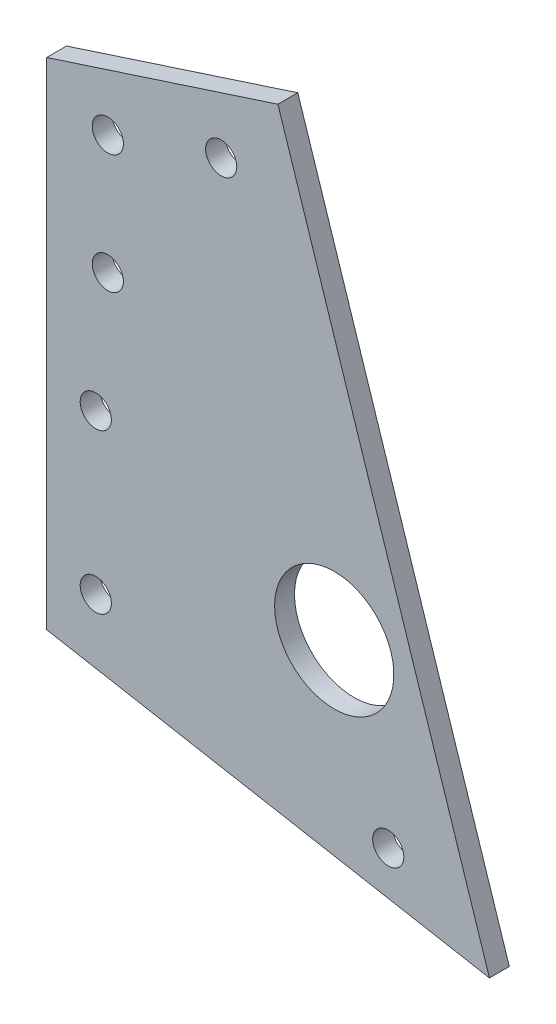
ISO-10303-21;
HEADER;
FILE_DESCRIPTION(('STEP AP214'),'2;1');
FILE_NAME('part.step','',(''),(''),'','','');
FILE_SCHEMA(('AUTOMOTIVE_DESIGN { 1 0 10303 214 1 1 1 1 }'));
ENDSEC;
DATA;
#1=APPLICATION_CONTEXT('core data for automotive mechanical design processes');
#2=APPLICATION_PROTOCOL_DEFINITION('international standard','automotive_design',2000,#1);
#3=PRODUCT_CONTEXT('',#1,'mechanical');
#4=PRODUCT('Part','Part','',(#3));
#5=PRODUCT_RELATED_PRODUCT_CATEGORY('part','',(#4));
#6=PRODUCT_DEFINITION_FORMATION('','',#4);
#7=PRODUCT_DEFINITION_CONTEXT('part definition',#1,'design');
#8=PRODUCT_DEFINITION('design','',#6,#7);
#9=PRODUCT_DEFINITION_SHAPE('','',#8);
#10=(LENGTH_UNIT() NAMED_UNIT(*) SI_UNIT(.MILLI.,.METRE.));
#11=(NAMED_UNIT(*) PLANE_ANGLE_UNIT() SI_UNIT($,.RADIAN.));
#12=(NAMED_UNIT(*) SI_UNIT($,.STERADIAN.) SOLID_ANGLE_UNIT());
#13=UNCERTAINTY_MEASURE_WITH_UNIT(LENGTH_MEASURE(1.E-05),#10,'distance_accuracy_value','');
#14=(GEOMETRIC_REPRESENTATION_CONTEXT(3) GLOBAL_UNCERTAINTY_ASSIGNED_CONTEXT((#13)) GLOBAL_UNIT_ASSIGNED_CONTEXT((#10,
#11,#12)) REPRESENTATION_CONTEXT('',''));
#15=CARTESIAN_POINT('',(0.,0.,0.));
#16=DIRECTION('',(0.,0.,1.));
#17=DIRECTION('',(1.,0.,0.));
#18=AXIS2_PLACEMENT_3D('',#15,#16,#17);
#19=CARTESIAN_POINT('',(0.,0.,0.));
#20=DIRECTION('',(0.,0.,-1.));
#21=DIRECTION('',(-1.,0.,0.));
#22=AXIS2_PLACEMENT_3D('',#19,#20,#21);
#23=PLANE('',#22);
#24=CARTESIAN_POINT('',(50.7999999999939,225.425000000021,0.));
#25=DIRECTION('',(0.,0.,-1.));
#26=DIRECTION('',(-1.,0.,0.));
#27=AXIS2_PLACEMENT_3D('',#24,#25,#26);
#28=CIRCLE('',#27,9.52499999983414);
#29=CARTESIAN_POINT('',(41.2750000001598,225.425000000021,0.));
#30=VERTEX_POINT('',#29);
#31=EDGE_CURVE('E152',#30,#30,#28,.T.);
#32=ORIENTED_EDGE('',*,*,#31,.F.);
#33=EDGE_LOOP('',(#32));
#34=FACE_BOUND('',#33,.T.);
#35=CARTESIAN_POINT('',(59.4351547545116,200.980257063771,0.));
#36=DIRECTION('',(0.,0.,1.));
#37=DIRECTION('',(1.,0.,0.));
#38=AXIS2_PLACEMENT_3D('',#35,#36,#37);
#39=CIRCLE('',#38,2.4892);
#40=CARTESIAN_POINT('',(61.9243547545116,200.980257063771,0.));
#41=VERTEX_POINT('',#40);
#42=EDGE_CURVE('E139',#41,#41,#39,.T.);
#43=ORIENTED_EDGE('',*,*,#42,.T.);
#44=EDGE_LOOP('',(#43));
#45=FACE_BOUND('',#44,.T.);
#46=DIRECTION('',(-0.951044316037913,-0.309054540384021,0.));
#47=VECTOR('',#46,1.);
#48=CARTESIAN_POINT('',(41.8046645445532,295.098572729783,0.));
#49=LINE('',#48,#47);
#50=CARTESIAN_POINT('',(41.8046645445532,295.098572729783,0.));
#51=VERTEX_POINT('',#50);
#52=CARTESIAN_POINT('',(4.85420955230369,283.091029346121,0.));
#53=VERTEX_POINT('',#52);
#54=EDGE_CURVE('E102',#51,#53,#49,.T.);
#55=ORIENTED_EDGE('',*,*,#54,.F.);
#56=DIRECTION('',(-0.309054540384021,0.951044316037913,0.));
#57=VECTOR('',#56,1.);
#58=CARTESIAN_POINT('',(75.6055152244678,191.08422342938,0.));
#59=LINE('',#58,#57);
#60=CARTESIAN_POINT('',(75.6055152244678,191.08422342938,0.));
#61=VERTEX_POINT('',#60);
#62=EDGE_CURVE('E77',#61,#51,#59,.T.);
#63=ORIENTED_EDGE('',*,*,#62,.F.);
#64=DIRECTION('',(0.983983880096338,-0.178257464669943,0.));
#65=VECTOR('',#64,1.);
#66=CARTESIAN_POINT('',(4.8542095523037,203.901454103905,0.));
#67=LINE('',#66,#65);
#68=CARTESIAN_POINT('',(4.8542095523037,203.901454103905,0.));
#69=VERTEX_POINT('',#68);
#70=EDGE_CURVE('E71',#69,#61,#67,.T.);
#71=ORIENTED_EDGE('',*,*,#70,.F.);
#72=DIRECTION('',(0.,-1.,0.));
#73=VECTOR('',#72,1.);
#74=CARTESIAN_POINT('',(4.85420955230369,283.091029346121,0.));
#75=LINE('',#74,#73);
#76=EDGE_CURVE('E94',#53,#69,#75,.T.);
#77=ORIENTED_EDGE('',*,*,#76,.F.);
#78=EDGE_LOOP('',(#55,#63,#71,#77));
#79=FACE_BOUND('',#78,.T.);
#80=CARTESIAN_POINT('',(14.6226253109059,258.201946220132,0.));
#81=DIRECTION('',(0.,0.,1.));
#82=DIRECTION('',(1.,0.,0.));
#83=AXIS2_PLACEMENT_3D('',#80,#81,#82);
#84=CIRCLE('',#83,2.4892);
#85=CARTESIAN_POINT('',(17.1118253109059,258.201946220132,0.));
#86=VERTEX_POINT('',#85);
#87=EDGE_CURVE('E105',#86,#86,#84,.T.);
#88=ORIENTED_EDGE('',*,*,#87,.T.);
#89=EDGE_LOOP('',(#88));
#90=FACE_BOUND('',#89,.T.);
#91=CARTESIAN_POINT('',(14.6226253109059,277.251946220133,0.));
#92=DIRECTION('',(0.,0.,1.));
#93=DIRECTION('',(1.,0.,0.));
#94=AXIS2_PLACEMENT_3D('',#91,#92,#93);
#95=CIRCLE('',#94,2.4892);
#96=CARTESIAN_POINT('',(17.1118253109059,277.251946220133,0.));
#97=VERTEX_POINT('',#96);
#98=EDGE_CURVE('E121',#97,#97,#95,.T.);
#99=ORIENTED_EDGE('',*,*,#98,.T.);
#100=EDGE_LOOP('',(#99));
#101=FACE_BOUND('',#100,.T.);
#102=CARTESIAN_POINT('',(12.6999999999999,212.724999999999,0.));
#103=DIRECTION('',(0.,0.,1.));
#104=DIRECTION('',(1.,0.,0.));
#105=AXIS2_PLACEMENT_3D('',#102,#103,#104);
#106=CIRCLE('',#105,2.4892);
#107=CARTESIAN_POINT('',(15.1891999999999,212.724999999999,0.));
#108=VERTEX_POINT('',#107);
#109=EDGE_CURVE('E127',#108,#108,#106,.T.);
#110=ORIENTED_EDGE('',*,*,#109,.T.);
#111=EDGE_LOOP('',(#110));
#112=FACE_BOUND('',#111,.T.);
#113=CARTESIAN_POINT('',(12.6999999999999,238.124999999999,0.));
#114=DIRECTION('',(0.,0.,1.));
#115=DIRECTION('',(1.,0.,0.));
#116=AXIS2_PLACEMENT_3D('',#113,#114,#115);
#117=CIRCLE('',#116,2.4892);
#118=CARTESIAN_POINT('',(15.1891999999999,238.124999999999,0.));
#119=VERTEX_POINT('',#118);
#120=EDGE_CURVE('E133',#119,#119,#117,.T.);
#121=ORIENTED_EDGE('',*,*,#120,.T.);
#122=EDGE_LOOP('',(#121));
#123=FACE_BOUND('',#122,.T.);
#124=CARTESIAN_POINT('',(32.7402519463279,283.138719962978,0.));
#125=DIRECTION('',(0.,0.,1.));
#126=DIRECTION('',(1.,0.,0.));
#127=AXIS2_PLACEMENT_3D('',#124,#125,#126);
#128=CIRCLE('',#127,2.4892);
#129=CARTESIAN_POINT('',(35.2294519463279,283.138719962978,0.));
#130=VERTEX_POINT('',#129);
#131=EDGE_CURVE('E145',#130,#130,#128,.T.);
#132=ORIENTED_EDGE('',*,*,#131,.T.);
#133=EDGE_LOOP('',(#132));
#134=FACE_BOUND('',#133,.T.);
#135=ADVANCED_FACE('F37',(#34,#45,#79,#90,#101,#112,#123,#134),#23,.T.);
#136=CARTESIAN_POINT('',(0.,0.,3.175));
#137=DIRECTION('',(0.,0.,-1.));
#138=DIRECTION('',(-1.,0.,0.));
#139=AXIS2_PLACEMENT_3D('',#136,#137,#138);
#140=PLANE('',#139);
#141=CARTESIAN_POINT('',(50.7999999999939,225.425000000021,3.175));
#142=DIRECTION('',(0.,0.,-1.));
#143=DIRECTION('',(-1.,0.,0.));
#144=AXIS2_PLACEMENT_3D('',#141,#142,#143);
#145=CIRCLE('',#144,9.52499999983414);
#146=CARTESIAN_POINT('',(41.2750000001598,225.425000000021,3.175));
#147=VERTEX_POINT('',#146);
#148=EDGE_CURVE('E151',#147,#147,#145,.T.);
#149=ORIENTED_EDGE('',*,*,#148,.T.);
#150=EDGE_LOOP('',(#149));
#151=FACE_BOUND('',#150,.T.);
#152=CARTESIAN_POINT('',(32.7402519463279,283.138719962978,3.175));
#153=DIRECTION('',(0.,0.,1.));
#154=DIRECTION('',(1.,0.,0.));
#155=AXIS2_PLACEMENT_3D('',#152,#153,#154);
#156=CIRCLE('',#155,2.48919999999999);
#157=CARTESIAN_POINT('',(35.2294519463279,283.138719962978,3.175));
#158=VERTEX_POINT('',#157);
#159=EDGE_CURVE('E148',#158,#158,#156,.T.);
#160=ORIENTED_EDGE('',*,*,#159,.F.);
#161=EDGE_LOOP('',(#160));
#162=FACE_BOUND('',#161,.T.);
#163=CARTESIAN_POINT('',(12.6999999999999,238.124999999999,3.175));
#164=DIRECTION('',(0.,0.,1.));
#165=DIRECTION('',(1.,0.,0.));
#166=AXIS2_PLACEMENT_3D('',#163,#164,#165);
#167=CIRCLE('',#166,2.48919999999999);
#168=CARTESIAN_POINT('',(15.1891999999999,238.124999999999,3.175));
#169=VERTEX_POINT('',#168);
#170=EDGE_CURVE('E136',#169,#169,#167,.T.);
#171=ORIENTED_EDGE('',*,*,#170,.F.);
#172=EDGE_LOOP('',(#171));
#173=FACE_BOUND('',#172,.T.);
#174=CARTESIAN_POINT('',(12.6999999999999,212.724999999999,3.175));
#175=DIRECTION('',(0.,0.,1.));
#176=DIRECTION('',(1.,0.,0.));
#177=AXIS2_PLACEMENT_3D('',#174,#175,#176);
#178=CIRCLE('',#177,2.48919999999999);
#179=CARTESIAN_POINT('',(15.1891999999999,212.724999999999,3.175));
#180=VERTEX_POINT('',#179);
#181=EDGE_CURVE('E130',#180,#180,#178,.T.);
#182=ORIENTED_EDGE('',*,*,#181,.F.);
#183=EDGE_LOOP('',(#182));
#184=FACE_BOUND('',#183,.T.);
#185=CARTESIAN_POINT('',(14.6226253109059,277.251946220133,3.175));
#186=DIRECTION('',(0.,0.,1.));
#187=DIRECTION('',(1.,0.,0.));
#188=AXIS2_PLACEMENT_3D('',#185,#186,#187);
#189=CIRCLE('',#188,2.48919999999999);
#190=CARTESIAN_POINT('',(17.1118253109059,277.251946220133,3.175));
#191=VERTEX_POINT('',#190);
#192=EDGE_CURVE('E124',#191,#191,#189,.T.);
#193=ORIENTED_EDGE('',*,*,#192,.F.);
#194=EDGE_LOOP('',(#193));
#195=FACE_BOUND('',#194,.T.);
#196=CARTESIAN_POINT('',(14.6226253109059,258.201946220132,3.175));
#197=DIRECTION('',(0.,0.,1.));
#198=DIRECTION('',(1.,0.,0.));
#199=AXIS2_PLACEMENT_3D('',#196,#197,#198);
#200=CIRCLE('',#199,2.48919999999999);
#201=CARTESIAN_POINT('',(17.1118253109059,258.201946220132,3.175));
#202=VERTEX_POINT('',#201);
#203=EDGE_CURVE('E118',#202,#202,#200,.T.);
#204=ORIENTED_EDGE('',*,*,#203,.F.);
#205=EDGE_LOOP('',(#204));
#206=FACE_BOUND('',#205,.T.);
#207=DIRECTION('',(-0.951044316037913,-0.309054540384021,0.));
#208=VECTOR('',#207,1.);
#209=CARTESIAN_POINT('',(41.8046645445532,295.098572729783,3.175));
#210=LINE('',#209,#208);
#211=CARTESIAN_POINT('',(41.8046645445532,295.098572729783,3.175));
#212=VERTEX_POINT('',#211);
#213=CARTESIAN_POINT('',(4.85420955230369,283.091029346121,3.175));
#214=VERTEX_POINT('',#213);
#215=EDGE_CURVE('E90',#212,#214,#210,.T.);
#216=ORIENTED_EDGE('',*,*,#215,.T.);
#217=DIRECTION('',(0.,-1.,0.));
#218=VECTOR('',#217,1.);
#219=CARTESIAN_POINT('',(4.85420955230369,283.091029346121,3.175));
#220=LINE('',#219,#218);
#221=CARTESIAN_POINT('',(4.8542095523037,203.901454103905,3.175));
#222=VERTEX_POINT('',#221);
#223=EDGE_CURVE('E84',#214,#222,#220,.T.);
#224=ORIENTED_EDGE('',*,*,#223,.T.);
#225=DIRECTION('',(0.983983880096338,-0.178257464669943,0.));
#226=VECTOR('',#225,1.);
#227=CARTESIAN_POINT('',(4.8542095523037,203.901454103905,3.175));
#228=LINE('',#227,#226);
#229=CARTESIAN_POINT('',(75.6055152244678,191.08422342938,3.175));
#230=VERTEX_POINT('',#229);
#231=EDGE_CURVE('E88',#222,#230,#228,.T.);
#232=ORIENTED_EDGE('',*,*,#231,.T.);
#233=DIRECTION('',(-0.309054540384021,0.951044316037913,0.));
#234=VECTOR('',#233,1.);
#235=CARTESIAN_POINT('',(75.6055152244678,191.08422342938,3.175));
#236=LINE('',#235,#234);
#237=EDGE_CURVE('E54',#230,#212,#236,.T.);
#238=ORIENTED_EDGE('',*,*,#237,.T.);
#239=EDGE_LOOP('',(#216,#224,#232,#238));
#240=FACE_BOUND('',#239,.T.);
#241=CARTESIAN_POINT('',(59.4351547545116,200.980257063771,3.175));
#242=DIRECTION('',(0.,0.,1.));
#243=DIRECTION('',(1.,0.,0.));
#244=AXIS2_PLACEMENT_3D('',#241,#242,#243);
#245=CIRCLE('',#244,2.48919999999999);
#246=CARTESIAN_POINT('',(61.9243547545116,200.980257063771,3.175));
#247=VERTEX_POINT('',#246);
#248=EDGE_CURVE('E142',#247,#247,#245,.T.);
#249=ORIENTED_EDGE('',*,*,#248,.F.);
#250=EDGE_LOOP('',(#249));
#251=FACE_BOUND('',#250,.T.);
#252=ADVANCED_FACE('F85',(#151,#162,#173,#184,#195,#206,#240,#251),#140,.F.);
#253=CARTESIAN_POINT('',(41.8046645445532,295.098572729783,3.175));
#254=DIRECTION('',(0.309054540384021,-0.951044316037913,0.));
#255=DIRECTION('',(0.951044316037913,0.309054540384021,0.));
#256=AXIS2_PLACEMENT_3D('',#253,#254,#255);
#257=PLANE('',#256);
#258=ORIENTED_EDGE('',*,*,#54,.T.);
#259=DIRECTION('',(0.,0.,-1.));
#260=VECTOR('',#259,1.);
#261=CARTESIAN_POINT('',(4.85420955230369,283.091029346121,3.175));
#262=LINE('',#261,#260);
#263=EDGE_CURVE('E11',#214,#53,#262,.T.);
#264=ORIENTED_EDGE('',*,*,#263,.F.);
#265=ORIENTED_EDGE('',*,*,#215,.F.);
#266=DIRECTION('',(0.,0.,-1.));
#267=VECTOR('',#266,1.);
#268=CARTESIAN_POINT('',(41.8046645445532,295.098572729783,3.175));
#269=LINE('',#268,#267);
#270=EDGE_CURVE('E98',#212,#51,#269,.T.);
#271=ORIENTED_EDGE('',*,*,#270,.T.);
#272=EDGE_LOOP('',(#258,#264,#265,#271));
#273=FACE_BOUND('',#272,.T.);
#274=ADVANCED_FACE('F39',(#273),#257,.F.);
#275=CARTESIAN_POINT('',(4.85420955230369,283.091029346121,3.175));
#276=DIRECTION('',(1.,0.,0.));
#277=DIRECTION('',(0.,1.,0.));
#278=AXIS2_PLACEMENT_3D('',#275,#276,#277);
#279=PLANE('',#278);
#280=ORIENTED_EDGE('',*,*,#76,.T.);
#281=DIRECTION('',(0.,0.,-1.));
#282=VECTOR('',#281,1.);
#283=CARTESIAN_POINT('',(4.8542095523037,203.901454103905,3.175));
#284=LINE('',#283,#282);
#285=EDGE_CURVE('E46',#222,#69,#284,.T.);
#286=ORIENTED_EDGE('',*,*,#285,.F.);
#287=ORIENTED_EDGE('',*,*,#223,.F.);
#288=ORIENTED_EDGE('',*,*,#263,.T.);
#289=EDGE_LOOP('',(#280,#286,#287,#288));
#290=FACE_BOUND('',#289,.T.);
#291=ADVANCED_FACE('F93',(#290),#279,.F.);
#292=CARTESIAN_POINT('',(4.8542095523037,203.901454103905,3.175));
#293=DIRECTION('',(0.178257464669943,0.983983880096338,0.));
#294=DIRECTION('',(-0.983983880096338,0.178257464669943,0.));
#295=AXIS2_PLACEMENT_3D('',#292,#293,#294);
#296=PLANE('',#295);
#297=ORIENTED_EDGE('',*,*,#70,.T.);
#298=DIRECTION('',(0.,0.,-1.));
#299=VECTOR('',#298,1.);
#300=CARTESIAN_POINT('',(75.6055152244678,191.08422342938,3.175));
#301=LINE('',#300,#299);
#302=EDGE_CURVE('E95',#230,#61,#301,.T.);
#303=ORIENTED_EDGE('',*,*,#302,.F.);
#304=ORIENTED_EDGE('',*,*,#231,.F.);
#305=ORIENTED_EDGE('',*,*,#285,.T.);
#306=EDGE_LOOP('',(#297,#303,#304,#305));
#307=FACE_BOUND('',#306,.T.);
#308=ADVANCED_FACE('F96',(#307),#296,.F.);
#309=CARTESIAN_POINT('',(75.6055152244678,191.08422342938,3.175));
#310=DIRECTION('',(-0.951044316037913,-0.309054540384021,0.));
#311=DIRECTION('',(0.309054540384021,-0.951044316037913,0.));
#312=AXIS2_PLACEMENT_3D('',#309,#310,#311);
#313=PLANE('',#312);
#314=ORIENTED_EDGE('',*,*,#62,.T.);
#315=ORIENTED_EDGE('',*,*,#270,.F.);
#316=ORIENTED_EDGE('',*,*,#237,.F.);
#317=ORIENTED_EDGE('',*,*,#302,.T.);
#318=EDGE_LOOP('',(#314,#315,#316,#317));
#319=FACE_BOUND('',#318,.T.);
#320=ADVANCED_FACE('F110',(#319),#313,.F.);
#321=CARTESIAN_POINT('',(14.6226253109059,258.201946220132,3.175));
#322=DIRECTION('',(0.,0.,1.));
#323=DIRECTION('',(1.,0.,0.));
#324=AXIS2_PLACEMENT_3D('',#321,#322,#323);
#325=CYLINDRICAL_SURFACE('',#324,2.4892);
#326=ORIENTED_EDGE('',*,*,#87,.F.);
#327=EDGE_LOOP('',(#326));
#328=FACE_BOUND('',#327,.T.);
#329=ORIENTED_EDGE('',*,*,#203,.T.);
#330=EDGE_LOOP('',(#329));
#331=FACE_BOUND('',#330,.T.);
#332=ADVANCED_FACE('F185',(#328,#331),#325,.F.);
#333=CARTESIAN_POINT('',(14.6226253109059,277.251946220133,3.175));
#334=DIRECTION('',(0.,0.,1.));
#335=DIRECTION('',(1.,0.,0.));
#336=AXIS2_PLACEMENT_3D('',#333,#334,#335);
#337=CYLINDRICAL_SURFACE('',#336,2.48919999999999);
#338=ORIENTED_EDGE('',*,*,#98,.F.);
#339=EDGE_LOOP('',(#338));
#340=FACE_BOUND('',#339,.T.);
#341=ORIENTED_EDGE('',*,*,#192,.T.);
#342=EDGE_LOOP('',(#341));
#343=FACE_BOUND('',#342,.T.);
#344=ADVANCED_FACE('F210',(#340,#343),#337,.F.);
#345=CARTESIAN_POINT('',(12.6999999999999,212.724999999999,3.175));
#346=DIRECTION('',(0.,0.,1.));
#347=DIRECTION('',(1.,0.,0.));
#348=AXIS2_PLACEMENT_3D('',#345,#346,#347);
#349=CYLINDRICAL_SURFACE('',#348,2.48919999999999);
#350=ORIENTED_EDGE('',*,*,#109,.F.);
#351=EDGE_LOOP('',(#350));
#352=FACE_BOUND('',#351,.T.);
#353=ORIENTED_EDGE('',*,*,#181,.T.);
#354=EDGE_LOOP('',(#353));
#355=FACE_BOUND('',#354,.T.);
#356=ADVANCED_FACE('F217',(#352,#355),#349,.F.);
#357=CARTESIAN_POINT('',(12.6999999999999,238.124999999999,3.175));
#358=DIRECTION('',(0.,0.,1.));
#359=DIRECTION('',(1.,0.,0.));
#360=AXIS2_PLACEMENT_3D('',#357,#358,#359);
#361=CYLINDRICAL_SURFACE('',#360,2.48919999999999);
#362=ORIENTED_EDGE('',*,*,#120,.F.);
#363=EDGE_LOOP('',(#362));
#364=FACE_BOUND('',#363,.T.);
#365=ORIENTED_EDGE('',*,*,#170,.T.);
#366=EDGE_LOOP('',(#365));
#367=FACE_BOUND('',#366,.T.);
#368=ADVANCED_FACE('F175',(#364,#367),#361,.F.);
#369=CARTESIAN_POINT('',(59.4351547545116,200.980257063771,3.175));
#370=DIRECTION('',(0.,0.,1.));
#371=DIRECTION('',(1.,0.,0.));
#372=AXIS2_PLACEMENT_3D('',#369,#370,#371);
#373=CYLINDRICAL_SURFACE('',#372,2.48919999999999);
#374=ORIENTED_EDGE('',*,*,#42,.F.);
#375=EDGE_LOOP('',(#374));
#376=FACE_BOUND('',#375,.T.);
#377=ORIENTED_EDGE('',*,*,#248,.T.);
#378=EDGE_LOOP('',(#377));
#379=FACE_BOUND('',#378,.T.);
#380=ADVANCED_FACE('F172',(#376,#379),#373,.F.);
#381=CARTESIAN_POINT('',(32.7402519463279,283.138719962978,3.175));
#382=DIRECTION('',(0.,0.,1.));
#383=DIRECTION('',(1.,0.,0.));
#384=AXIS2_PLACEMENT_3D('',#381,#382,#383);
#385=CYLINDRICAL_SURFACE('',#384,2.48919999999999);
#386=ORIENTED_EDGE('',*,*,#131,.F.);
#387=EDGE_LOOP('',(#386));
#388=FACE_BOUND('',#387,.T.);
#389=ORIENTED_EDGE('',*,*,#159,.T.);
#390=EDGE_LOOP('',(#389));
#391=FACE_BOUND('',#390,.T.);
#392=ADVANCED_FACE('F163',(#388,#391),#385,.F.);
#393=CARTESIAN_POINT('',(50.7999999999939,225.425000000021,3.175));
#394=DIRECTION('',(0.,0.,-1.));
#395=DIRECTION('',(-1.,0.,0.));
#396=AXIS2_PLACEMENT_3D('',#393,#394,#395);
#397=CYLINDRICAL_SURFACE('',#396,9.52499999983414);
#398=ORIENTED_EDGE('',*,*,#148,.F.);
#399=EDGE_LOOP('',(#398));
#400=FACE_BOUND('',#399,.T.);
#401=ORIENTED_EDGE('',*,*,#31,.T.);
#402=EDGE_LOOP('',(#401));
#403=FACE_BOUND('',#402,.T.);
#404=ADVANCED_FACE('F160',(#400,#403),#397,.F.);
#405=CLOSED_SHELL('',(#135,#252,#274,#291,#308,#320,#332,#344,#356,#368,#380,#392,#404));
#406=MANIFOLD_SOLID_BREP('B2',#405);
#407=ADVANCED_BREP_SHAPE_REPRESENTATION('',(#18,#406),#14);
#408=SHAPE_DEFINITION_REPRESENTATION(#9,#407);
ENDSEC;
END-ISO-10303-21;
